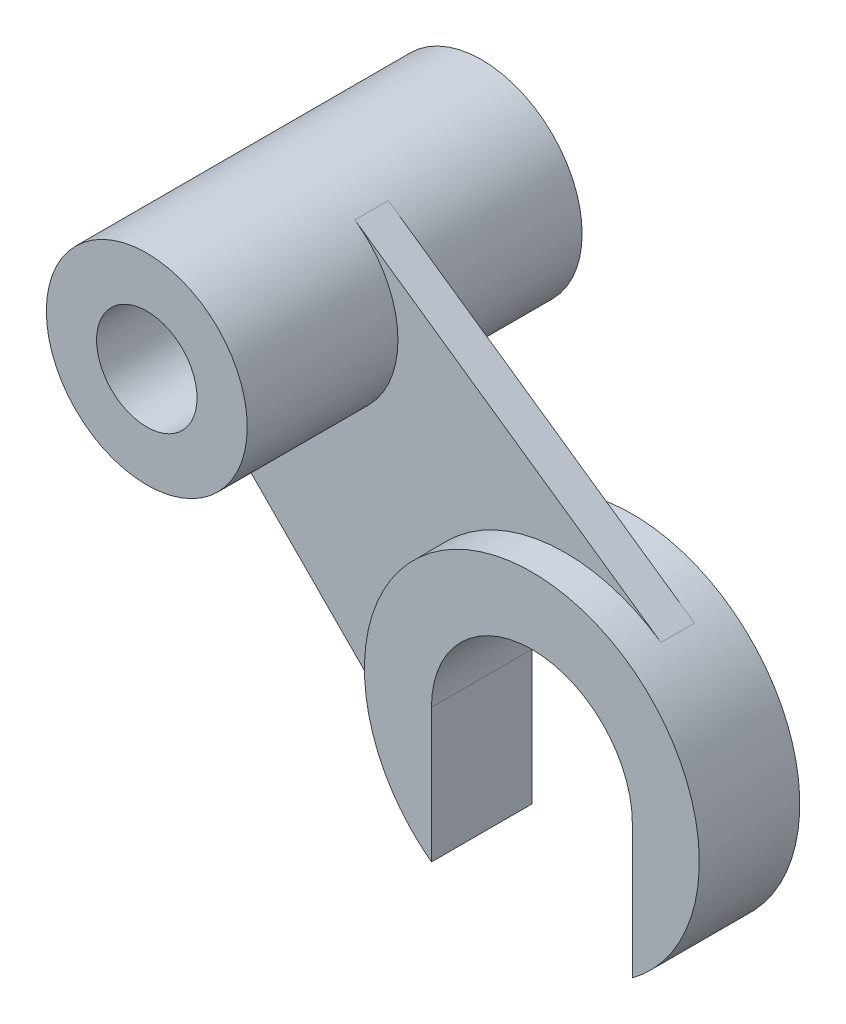
ISO-10303-21;
HEADER;
FILE_DESCRIPTION(('STEP AP214'),'2;1');
FILE_NAME('part.step','',(''),(''),'','','');
FILE_SCHEMA(('AUTOMOTIVE_DESIGN { 1 0 10303 214 1 1 1 1 }'));
ENDSEC;
DATA;
#1=APPLICATION_CONTEXT('core data for automotive mechanical design processes');
#2=APPLICATION_PROTOCOL_DEFINITION('international standard','automotive_design',2000,#1);
#3=PRODUCT_CONTEXT('',#1,'mechanical');
#4=PRODUCT('Part','Part','',(#3));
#5=PRODUCT_RELATED_PRODUCT_CATEGORY('part','',(#4));
#6=PRODUCT_DEFINITION_FORMATION('','',#4);
#7=PRODUCT_DEFINITION_CONTEXT('part definition',#1,'design');
#8=PRODUCT_DEFINITION('design','',#6,#7);
#9=PRODUCT_DEFINITION_SHAPE('','',#8);
#10=(LENGTH_UNIT() NAMED_UNIT(*) SI_UNIT(.MILLI.,.METRE.));
#11=(NAMED_UNIT(*) PLANE_ANGLE_UNIT() SI_UNIT($,.RADIAN.));
#12=(NAMED_UNIT(*) SI_UNIT($,.STERADIAN.) SOLID_ANGLE_UNIT());
#13=UNCERTAINTY_MEASURE_WITH_UNIT(LENGTH_MEASURE(1.E-05),#10,'distance_accuracy_value','');
#14=(GEOMETRIC_REPRESENTATION_CONTEXT(3) GLOBAL_UNCERTAINTY_ASSIGNED_CONTEXT((#13)) GLOBAL_UNIT_ASSIGNED_CONTEXT((#10,
#11,#12)) REPRESENTATION_CONTEXT('',''));
#15=CARTESIAN_POINT('',(0.,0.,0.));
#16=DIRECTION('',(0.,0.,1.));
#17=DIRECTION('',(1.,0.,0.));
#18=AXIS2_PLACEMENT_3D('',#15,#16,#17);
#19=CARTESIAN_POINT('',(0.,0.,50.));
#20=DIRECTION('',(0.,0.,-1.));
#21=DIRECTION('',(-1.,0.,0.));
#22=AXIS2_PLACEMENT_3D('',#19,#20,#21);
#23=CYLINDRICAL_SURFACE('',#22,30.);
#24=DIRECTION('',(0.,0.,-1.));
#25=VECTOR('',#24,1.);
#26=CARTESIAN_POINT('',(-30.,0.,5.));
#27=LINE('',#26,#25);
#28=CARTESIAN_POINT('',(-30.,0.,5.));
#29=VERTEX_POINT('',#28);
#30=CARTESIAN_POINT('',(-30.,0.,-5.));
#31=VERTEX_POINT('',#30);
#32=EDGE_CURVE('E68',#29,#31,#27,.T.);
#33=ORIENTED_EDGE('',*,*,#32,.F.);
#34=CARTESIAN_POINT('',(0.,0.,5.));
#35=DIRECTION('',(0.,0.,1.));
#36=DIRECTION('',(1.,0.,0.));
#37=AXIS2_PLACEMENT_3D('',#34,#35,#36);
#38=CIRCLE('',#37,30.);
#39=CARTESIAN_POINT('',(17.1291163606126,24.6291163606126,5.));
#40=VERTEX_POINT('',#39);
#41=EDGE_CURVE('E213',#29,#40,#38,.T.);
#42=ORIENTED_EDGE('',*,*,#41,.T.);
#43=DIRECTION('',(0.,0.,-1.));
#44=VECTOR('',#43,1.);
#45=CARTESIAN_POINT('',(17.1291163606126,24.6291163606126,5.));
#46=LINE('',#45,#44);
#47=CARTESIAN_POINT('',(17.1291163606126,24.6291163606126,-5.));
#48=VERTEX_POINT('',#47);
#49=EDGE_CURVE('E175',#40,#48,#46,.T.);
#50=ORIENTED_EDGE('',*,*,#49,.T.);
#51=CARTESIAN_POINT('',(0.,0.,-5.));
#52=DIRECTION('',(0.,0.,1.));
#53=DIRECTION('',(1.,0.,0.));
#54=AXIS2_PLACEMENT_3D('',#51,#52,#53);
#55=CIRCLE('',#54,30.);
#56=EDGE_CURVE('E206',#31,#48,#55,.T.);
#57=ORIENTED_EDGE('',*,*,#56,.F.);
#58=EDGE_LOOP('',(#33,#42,#50,#57));
#59=FACE_BOUND('',#58,.T.);
#60=CARTESIAN_POINT('',(0.,0.,50.));
#61=DIRECTION('',(0.,0.,1.));
#62=DIRECTION('',(1.,0.,0.));
#63=AXIS2_PLACEMENT_3D('',#60,#61,#62);
#64=CIRCLE('',#63,30.);
#65=CARTESIAN_POINT('',(30.,0.,50.));
#66=VERTEX_POINT('',#65);
#67=EDGE_CURVE('E202',#66,#66,#64,.T.);
#68=ORIENTED_EDGE('',*,*,#67,.F.);
#69=EDGE_LOOP('',(#68));
#70=FACE_BOUND('',#69,.T.);
#71=CARTESIAN_POINT('',(0.,0.,-50.));
#72=DIRECTION('',(0.,0.,1.));
#73=DIRECTION('',(1.,0.,0.));
#74=AXIS2_PLACEMENT_3D('',#71,#72,#73);
#75=CIRCLE('',#74,30.);
#76=CARTESIAN_POINT('',(30.,0.,-50.));
#77=VERTEX_POINT('',#76);
#78=EDGE_CURVE('E201',#77,#77,#75,.T.);
#79=ORIENTED_EDGE('',*,*,#78,.T.);
#80=EDGE_LOOP('',(#79));
#81=FACE_BOUND('',#80,.T.);
#82=ADVANCED_FACE('F45',(#59,#70,#81),#23,.T.);
#83=CARTESIAN_POINT('',(0.,0.,50.));
#84=DIRECTION('',(0.,0.,1.));
#85=DIRECTION('',(1.,0.,0.));
#86=AXIS2_PLACEMENT_3D('',#83,#84,#85);
#87=PLANE('',#86);
#88=CARTESIAN_POINT('',(0.,0.,50.));
#89=DIRECTION('',(0.,0.,1.));
#90=DIRECTION('',(1.,0.,0.));
#91=AXIS2_PLACEMENT_3D('',#88,#89,#90);
#92=CIRCLE('',#91,15.);
#93=CARTESIAN_POINT('',(15.,0.,50.));
#94=VERTEX_POINT('',#93);
#95=EDGE_CURVE('E384',#94,#94,#92,.T.);
#96=ORIENTED_EDGE('',*,*,#95,.F.);
#97=EDGE_LOOP('',(#96));
#98=FACE_BOUND('',#97,.T.);
#99=ORIENTED_EDGE('',*,*,#67,.T.);
#100=EDGE_LOOP('',(#99));
#101=FACE_BOUND('',#100,.T.);
#102=ADVANCED_FACE('F245',(#98,#101),#87,.T.);
#103=CARTESIAN_POINT('',(0.,0.,-50.));
#104=DIRECTION('',(0.,0.,1.));
#105=DIRECTION('',(1.,0.,0.));
#106=AXIS2_PLACEMENT_3D('',#103,#104,#105);
#107=PLANE('',#106);
#108=CARTESIAN_POINT('',(0.,0.,-50.));
#109=DIRECTION('',(0.,0.,1.));
#110=DIRECTION('',(1.,0.,0.));
#111=AXIS2_PLACEMENT_3D('',#108,#109,#110);
#112=CIRCLE('',#111,15.);
#113=CARTESIAN_POINT('',(15.,0.,-50.));
#114=VERTEX_POINT('',#113);
#115=EDGE_CURVE('E134',#114,#114,#112,.T.);
#116=ORIENTED_EDGE('',*,*,#115,.T.);
#117=EDGE_LOOP('',(#116));
#118=FACE_BOUND('',#117,.T.);
#119=ORIENTED_EDGE('',*,*,#78,.F.);
#120=EDGE_LOOP('',(#119));
#121=FACE_BOUND('',#120,.T.);
#122=ADVANCED_FACE('F250',(#118,#121),#107,.F.);
#123=CARTESIAN_POINT('',(-30.,-40.,5.));
#124=DIRECTION('',(1.,0.,0.));
#125=DIRECTION('',(0.,1.,0.));
#126=AXIS2_PLACEMENT_3D('',#123,#124,#125);
#127=PLANE('',#126);
#128=DIRECTION('',(0.,-1.,0.));
#129=VECTOR('',#128,1.);
#130=CARTESIAN_POINT('',(-30.,-40.,-5.));
#131=LINE('',#130,#129);
#132=CARTESIAN_POINT('',(-30.,-40.,-5.));
#133=VERTEX_POINT('',#132);
#134=EDGE_CURVE('E163',#31,#133,#131,.T.);
#135=ORIENTED_EDGE('',*,*,#134,.T.);
#136=DIRECTION('',(0.,0.,-1.));
#137=VECTOR('',#136,1.);
#138=CARTESIAN_POINT('',(-30.,-40.,5.));
#139=LINE('',#138,#137);
#140=CARTESIAN_POINT('',(-30.,-40.,5.));
#141=VERTEX_POINT('',#140);
#142=EDGE_CURVE('E195',#141,#133,#139,.T.);
#143=ORIENTED_EDGE('',*,*,#142,.F.);
#144=DIRECTION('',(0.,-1.,0.));
#145=VECTOR('',#144,1.);
#146=CARTESIAN_POINT('',(-30.,-40.,5.));
#147=LINE('',#146,#145);
#148=EDGE_CURVE('E164',#29,#141,#147,.T.);
#149=ORIENTED_EDGE('',*,*,#148,.F.);
#150=ORIENTED_EDGE('',*,*,#32,.T.);
#151=EDGE_LOOP('',(#135,#143,#149,#150));
#152=FACE_BOUND('',#151,.T.);
#153=ADVANCED_FACE('F259',(#152),#127,.F.);
#154=CARTESIAN_POINT('',(44.4773646069221,-115.187247330964,5.));
#155=DIRECTION('',(0.710452707861558,0.703744946619285,0.));
#156=DIRECTION('',(-0.703744946619285,0.710452707861558,0.));
#157=AXIS2_PLACEMENT_3D('',#154,#155,#156);
#158=PLANE('',#157);
#159=DIRECTION('',(0.703744946619285,-0.710452707861558,0.));
#160=VECTOR('',#159,1.);
#161=CARTESIAN_POINT('',(44.4773646069221,-115.187247330964,-5.));
#162=LINE('',#161,#160);
#163=CARTESIAN_POINT('',(44.4773646069221,-115.187247330964,-5.));
#164=VERTEX_POINT('',#163);
#165=EDGE_CURVE('E178',#133,#164,#162,.T.);
#166=ORIENTED_EDGE('',*,*,#165,.T.);
#167=DIRECTION('',(0.,0.,-1.));
#168=VECTOR('',#167,1.);
#169=CARTESIAN_POINT('',(44.4773646069221,-115.187247330964,5.));
#170=LINE('',#169,#168);
#171=CARTESIAN_POINT('',(44.4773646069221,-115.187247330964,5.));
#172=VERTEX_POINT('',#171);
#173=EDGE_CURVE('E191',#172,#164,#170,.T.);
#174=ORIENTED_EDGE('',*,*,#173,.F.);
#175=DIRECTION('',(0.703744946619285,-0.710452707861558,0.));
#176=VECTOR('',#175,1.);
#177=CARTESIAN_POINT('',(44.4773646069221,-115.187247330964,5.));
#178=LINE('',#177,#176);
#179=EDGE_CURVE('E167',#141,#172,#178,.T.);
#180=ORIENTED_EDGE('',*,*,#179,.F.);
#181=ORIENTED_EDGE('',*,*,#142,.T.);
#182=EDGE_LOOP('',(#166,#174,#180,#181));
#183=FACE_BOUND('',#182,.T.);
#184=ADVANCED_FACE('F264',(#183),#158,.F.);
#185=CARTESIAN_POINT('',(17.1291163606126,24.6291163606126,5.));
#186=DIRECTION('',(-0.570970545353753,-0.820970545353753,0.));
#187=DIRECTION('',(0.820970545353753,-0.570970545353753,0.));
#188=AXIS2_PLACEMENT_3D('',#185,#186,#187);
#189=PLANE('',#188);
#190=DIRECTION('',(-0.820970545353753,0.570970545353753,0.));
#191=VECTOR('',#190,1.);
#192=CARTESIAN_POINT('',(17.1291163606126,24.6291163606126,-5.));
#193=LINE('',#192,#191);
#194=CARTESIAN_POINT('',(108.548527267688,-38.9514727323124,-5.));
#195=VERTEX_POINT('',#194);
#196=EDGE_CURVE('E168',#195,#48,#193,.T.);
#197=ORIENTED_EDGE('',*,*,#196,.T.);
#198=ORIENTED_EDGE('',*,*,#49,.F.);
#199=DIRECTION('',(-0.820970545353753,0.570970545353753,0.));
#200=VECTOR('',#199,1.);
#201=CARTESIAN_POINT('',(17.1291163606126,24.6291163606126,5.));
#202=LINE('',#201,#200);
#203=CARTESIAN_POINT('',(108.548527267688,-38.9514727323124,5.));
#204=VERTEX_POINT('',#203);
#205=EDGE_CURVE('E171',#204,#40,#202,.T.);
#206=ORIENTED_EDGE('',*,*,#205,.F.);
#207=DIRECTION('',(0.,0.,-1.));
#208=VECTOR('',#207,1.);
#209=CARTESIAN_POINT('',(108.548527267688,-38.9514727323124,5.));
#210=LINE('',#209,#208);
#211=EDGE_CURVE('E187',#204,#195,#210,.T.);
#212=ORIENTED_EDGE('',*,*,#211,.T.);
#213=EDGE_LOOP('',(#197,#198,#206,#212));
#214=FACE_BOUND('',#213,.T.);
#215=ADVANCED_FACE('F271',(#214),#189,.F.);
#216=CARTESIAN_POINT('',(0.,0.,5.));
#217=DIRECTION('',(0.,0.,1.));
#218=DIRECTION('',(1.,0.,0.));
#219=AXIS2_PLACEMENT_3D('',#216,#217,#218);
#220=PLANE('',#219);
#221=ORIENTED_EDGE('',*,*,#179,.T.);
#222=CARTESIAN_POINT('',(80.,-80.,5.));
#223=DIRECTION('',(0.,0.,1.));
#224=DIRECTION('',(1.,0.,0.));
#225=AXIS2_PLACEMENT_3D('',#222,#223,#224);
#226=CIRCLE('',#225,50.);
#227=EDGE_CURVE('E157',#172,#204,#226,.F.);
#228=ORIENTED_EDGE('',*,*,#227,.T.);
#229=ORIENTED_EDGE('',*,*,#205,.T.);
#230=ORIENTED_EDGE('',*,*,#41,.F.);
#231=ORIENTED_EDGE('',*,*,#148,.T.);
#232=EDGE_LOOP('',(#221,#228,#229,#230,#231));
#233=FACE_BOUND('',#232,.T.);
#234=ADVANCED_FACE('F238',(#233),#220,.T.);
#235=CARTESIAN_POINT('',(0.,0.,-5.));
#236=DIRECTION('',(0.,0.,1.));
#237=DIRECTION('',(1.,0.,0.));
#238=AXIS2_PLACEMENT_3D('',#235,#236,#237);
#239=PLANE('',#238);
#240=CARTESIAN_POINT('',(80.,-80.,-5.));
#241=DIRECTION('',(0.,0.,1.));
#242=DIRECTION('',(1.,0.,0.));
#243=AXIS2_PLACEMENT_3D('',#240,#241,#242);
#244=CIRCLE('',#243,50.);
#245=EDGE_CURVE('E216',#164,#195,#244,.F.);
#246=ORIENTED_EDGE('',*,*,#245,.F.);
#247=ORIENTED_EDGE('',*,*,#165,.F.);
#248=ORIENTED_EDGE('',*,*,#134,.F.);
#249=ORIENTED_EDGE('',*,*,#56,.T.);
#250=ORIENTED_EDGE('',*,*,#196,.F.);
#251=EDGE_LOOP('',(#246,#247,#248,#249,#250));
#252=FACE_BOUND('',#251,.T.);
#253=ADVANCED_FACE('F230',(#252),#239,.F.);
#254=CARTESIAN_POINT('',(80.,-80.,15.));
#255=DIRECTION('',(0.,0.,-1.));
#256=DIRECTION('',(-1.,0.,0.));
#257=AXIS2_PLACEMENT_3D('',#254,#255,#256);
#258=CYLINDRICAL_SURFACE('',#257,50.);
#259=ORIENTED_EDGE('',*,*,#227,.F.);
#260=ORIENTED_EDGE('',*,*,#173,.T.);
#261=ORIENTED_EDGE('',*,*,#245,.T.);
#262=ORIENTED_EDGE('',*,*,#211,.F.);
#263=EDGE_LOOP('',(#259,#260,#261,#262));
#264=FACE_BOUND('',#263,.T.);
#265=CARTESIAN_POINT('',(80.,-80.,15.));
#266=DIRECTION('',(0.,0.,1.));
#267=DIRECTION('',(1.,0.,0.));
#268=AXIS2_PLACEMENT_3D('',#265,#266,#267);
#269=CIRCLE('',#268,50.);
#270=CARTESIAN_POINT('',(110.,-120.,15.));
#271=VERTEX_POINT('',#270);
#272=CARTESIAN_POINT('',(50.,-120.,15.));
#273=VERTEX_POINT('',#272);
#274=EDGE_CURVE('E139',#271,#273,#269,.T.);
#275=ORIENTED_EDGE('',*,*,#274,.F.);
#276=DIRECTION('',(0.,0.,-1.));
#277=VECTOR('',#276,1.);
#278=CARTESIAN_POINT('',(110.,-120.,15.));
#279=LINE('',#278,#277);
#280=CARTESIAN_POINT('',(110.,-120.,-15.));
#281=VERTEX_POINT('',#280);
#282=EDGE_CURVE('E150',#271,#281,#279,.T.);
#283=ORIENTED_EDGE('',*,*,#282,.T.);
#284=CARTESIAN_POINT('',(80.,-80.,-15.));
#285=DIRECTION('',(0.,0.,1.));
#286=DIRECTION('',(1.,0.,0.));
#287=AXIS2_PLACEMENT_3D('',#284,#285,#286);
#288=CIRCLE('',#287,50.);
#289=CARTESIAN_POINT('',(50.,-120.,-15.));
#290=VERTEX_POINT('',#289);
#291=EDGE_CURVE('E154',#281,#290,#288,.T.);
#292=ORIENTED_EDGE('',*,*,#291,.T.);
#293=DIRECTION('',(0.,0.,-1.));
#294=VECTOR('',#293,1.);
#295=CARTESIAN_POINT('',(50.,-120.,15.));
#296=LINE('',#295,#294);
#297=EDGE_CURVE('E60',#290,#273,#296,.F.);
#298=ORIENTED_EDGE('',*,*,#297,.T.);
#299=EDGE_LOOP('',(#275,#283,#292,#298));
#300=FACE_BOUND('',#299,.T.);
#301=ADVANCED_FACE('F228',(#264,#300),#258,.T.);
#302=CARTESIAN_POINT('',(80.,-80.,15.));
#303=DIRECTION('',(0.,0.,1.));
#304=DIRECTION('',(1.,0.,0.));
#305=AXIS2_PLACEMENT_3D('',#302,#303,#304);
#306=PLANE('',#305);
#307=DIRECTION('',(0.,1.,0.));
#308=VECTOR('',#307,1.);
#309=CARTESIAN_POINT('',(110.,-80.,15.));
#310=LINE('',#309,#308);
#311=CARTESIAN_POINT('',(110.,-80.,15.));
#312=VERTEX_POINT('',#311);
#313=EDGE_CURVE('E124',#271,#312,#310,.T.);
#314=ORIENTED_EDGE('',*,*,#313,.F.);
#315=ORIENTED_EDGE('',*,*,#274,.T.);
#316=DIRECTION('',(0.,-1.,0.));
#317=VECTOR('',#316,1.);
#318=CARTESIAN_POINT('',(50.,-80.,15.));
#319=LINE('',#318,#317);
#320=CARTESIAN_POINT('',(50.,-80.,15.));
#321=VERTEX_POINT('',#320);
#322=EDGE_CURVE('E118',#321,#273,#319,.T.);
#323=ORIENTED_EDGE('',*,*,#322,.F.);
#324=CARTESIAN_POINT('',(80.,-80.,15.));
#325=DIRECTION('',(0.,0.,1.));
#326=DIRECTION('',(1.,0.,0.));
#327=AXIS2_PLACEMENT_3D('',#324,#325,#326);
#328=CIRCLE('',#327,30.);
#329=EDGE_CURVE('E127',#312,#321,#328,.T.);
#330=ORIENTED_EDGE('',*,*,#329,.F.);
#331=EDGE_LOOP('',(#314,#315,#323,#330));
#332=FACE_BOUND('',#331,.T.);
#333=ADVANCED_FACE('F137',(#332),#306,.T.);
#334=CARTESIAN_POINT('',(80.,-80.,-15.));
#335=DIRECTION('',(0.,0.,1.));
#336=DIRECTION('',(1.,0.,0.));
#337=AXIS2_PLACEMENT_3D('',#334,#335,#336);
#338=PLANE('',#337);
#339=ORIENTED_EDGE('',*,*,#291,.F.);
#340=DIRECTION('',(0.,1.,0.));
#341=VECTOR('',#340,1.);
#342=CARTESIAN_POINT('',(110.,-80.,-15.));
#343=LINE('',#342,#341);
#344=CARTESIAN_POINT('',(110.,-80.,-15.));
#345=VERTEX_POINT('',#344);
#346=EDGE_CURVE('E11',#281,#345,#343,.T.);
#347=ORIENTED_EDGE('',*,*,#346,.T.);
#348=CARTESIAN_POINT('',(80.,-80.,-15.));
#349=DIRECTION('',(0.,0.,1.));
#350=DIRECTION('',(1.,0.,0.));
#351=AXIS2_PLACEMENT_3D('',#348,#349,#350);
#352=CIRCLE('',#351,30.);
#353=CARTESIAN_POINT('',(50.,-80.,-15.));
#354=VERTEX_POINT('',#353);
#355=EDGE_CURVE('E53',#345,#354,#352,.T.);
#356=ORIENTED_EDGE('',*,*,#355,.T.);
#357=DIRECTION('',(0.,-1.,0.));
#358=VECTOR('',#357,1.);
#359=CARTESIAN_POINT('',(50.,-80.,-15.));
#360=LINE('',#359,#358);
#361=EDGE_CURVE('E119',#354,#290,#360,.T.);
#362=ORIENTED_EDGE('',*,*,#361,.T.);
#363=EDGE_LOOP('',(#339,#347,#356,#362));
#364=FACE_BOUND('',#363,.T.);
#365=ADVANCED_FACE('F224',(#364),#338,.F.);
#366=CARTESIAN_POINT('',(80.,-80.,-50.));
#367=DIRECTION('',(0.,0.,1.));
#368=DIRECTION('',(1.,0.,0.));
#369=AXIS2_PLACEMENT_3D('',#366,#367,#368);
#370=CYLINDRICAL_SURFACE('',#369,30.);
#371=DIRECTION('',(0.,0.,1.));
#372=VECTOR('',#371,1.);
#373=CARTESIAN_POINT('',(110.,-80.,-50.));
#374=LINE('',#373,#372);
#375=EDGE_CURVE('E123',#345,#312,#374,.T.);
#376=ORIENTED_EDGE('',*,*,#375,.T.);
#377=ORIENTED_EDGE('',*,*,#329,.T.);
#378=DIRECTION('',(0.,0.,1.));
#379=VECTOR('',#378,1.);
#380=CARTESIAN_POINT('',(50.,-80.,-50.));
#381=LINE('',#380,#379);
#382=EDGE_CURVE('E114',#354,#321,#381,.T.);
#383=ORIENTED_EDGE('',*,*,#382,.F.);
#384=ORIENTED_EDGE('',*,*,#355,.F.);
#385=EDGE_LOOP('',(#376,#377,#383,#384));
#386=FACE_BOUND('',#385,.T.);
#387=ADVANCED_FACE('F128',(#386),#370,.F.);
#388=CARTESIAN_POINT('',(110.,-80.,-50.));
#389=DIRECTION('',(1.,0.,0.));
#390=DIRECTION('',(0.,1.,0.));
#391=AXIS2_PLACEMENT_3D('',#388,#389,#390);
#392=PLANE('',#391);
#393=ORIENTED_EDGE('',*,*,#313,.T.);
#394=ORIENTED_EDGE('',*,*,#375,.F.);
#395=ORIENTED_EDGE('',*,*,#346,.F.);
#396=ORIENTED_EDGE('',*,*,#282,.F.);
#397=EDGE_LOOP('',(#393,#394,#395,#396));
#398=FACE_BOUND('',#397,.T.);
#399=ADVANCED_FACE('F226',(#398),#392,.F.);
#400=CARTESIAN_POINT('',(50.,-80.,-50.));
#401=DIRECTION('',(-1.,0.,0.));
#402=DIRECTION('',(0.,-1.,0.));
#403=AXIS2_PLACEMENT_3D('',#400,#401,#402);
#404=PLANE('',#403);
#405=ORIENTED_EDGE('',*,*,#361,.F.);
#406=ORIENTED_EDGE('',*,*,#382,.T.);
#407=ORIENTED_EDGE('',*,*,#322,.T.);
#408=ORIENTED_EDGE('',*,*,#297,.F.);
#409=EDGE_LOOP('',(#405,#406,#407,#408));
#410=FACE_BOUND('',#409,.T.);
#411=ADVANCED_FACE('F116',(#410),#404,.F.);
#412=CARTESIAN_POINT('',(0.,0.,50.));
#413=DIRECTION('',(0.,0.,1.));
#414=DIRECTION('',(1.,0.,0.));
#415=AXIS2_PLACEMENT_3D('',#412,#413,#414);
#416=CYLINDRICAL_SURFACE('',#415,15.);
#417=ORIENTED_EDGE('',*,*,#115,.F.);
#418=EDGE_LOOP('',(#417));
#419=FACE_BOUND('',#418,.T.);
#420=ORIENTED_EDGE('',*,*,#95,.T.);
#421=EDGE_LOOP('',(#420));
#422=FACE_BOUND('',#421,.T.);
#423=ADVANCED_FACE('F322',(#419,#422),#416,.F.);
#424=CLOSED_SHELL('',(#82,#102,#122,#153,#184,#215,#234,#253,#301,#333,#365,#387,#399,#411,#423));
#425=MANIFOLD_SOLID_BREP('B2',#424);
#426=ADVANCED_BREP_SHAPE_REPRESENTATION('',(#18,#425),#14);
#427=SHAPE_DEFINITION_REPRESENTATION(#9,#426);
ENDSEC;
END-ISO-10303-21;
